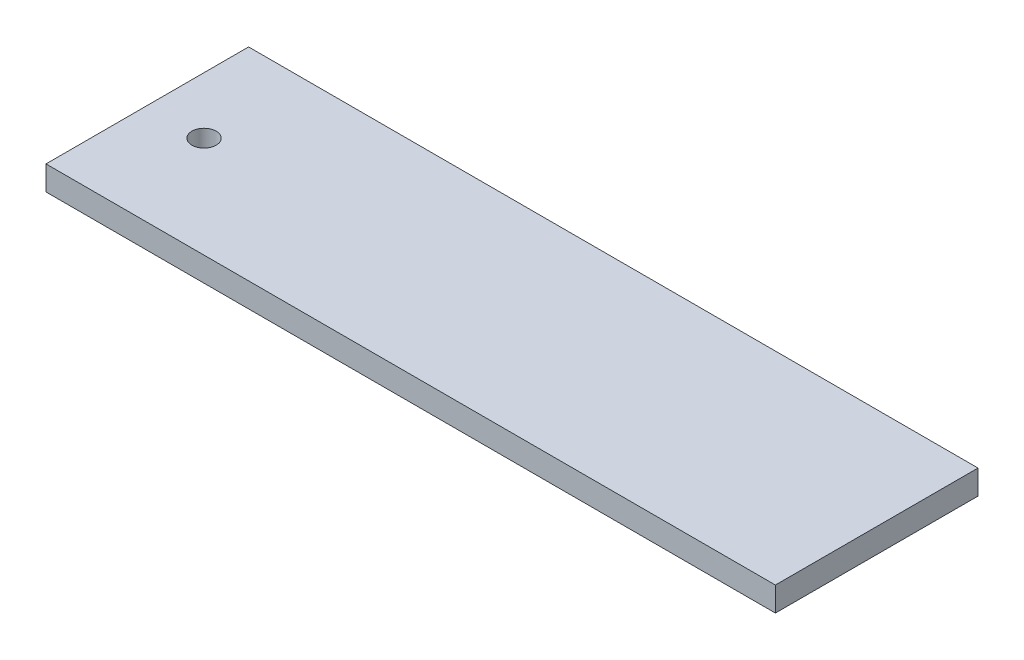
ISO-10303-21;
HEADER;
FILE_DESCRIPTION(('STEP AP214'),'2;1');
FILE_NAME('part.step','',(''),(''),'','','');
FILE_SCHEMA(('AUTOMOTIVE_DESIGN { 1 0 10303 214 1 1 1 1 }'));
ENDSEC;
DATA;
#1=APPLICATION_CONTEXT('core data for automotive mechanical design processes');
#2=APPLICATION_PROTOCOL_DEFINITION('international standard','automotive_design',2000,#1);
#3=PRODUCT_CONTEXT('',#1,'mechanical');
#4=PRODUCT('Part','Part','',(#3));
#5=PRODUCT_RELATED_PRODUCT_CATEGORY('part','',(#4));
#6=PRODUCT_DEFINITION_FORMATION('','',#4);
#7=PRODUCT_DEFINITION_CONTEXT('part definition',#1,'design');
#8=PRODUCT_DEFINITION('design','',#6,#7);
#9=PRODUCT_DEFINITION_SHAPE('','',#8);
#10=(LENGTH_UNIT() NAMED_UNIT(*) SI_UNIT(.MILLI.,.METRE.));
#11=(NAMED_UNIT(*) PLANE_ANGLE_UNIT() SI_UNIT($,.RADIAN.));
#12=(NAMED_UNIT(*) SI_UNIT($,.STERADIAN.) SOLID_ANGLE_UNIT());
#13=UNCERTAINTY_MEASURE_WITH_UNIT(LENGTH_MEASURE(1.E-05),#10,'distance_accuracy_value','');
#14=(GEOMETRIC_REPRESENTATION_CONTEXT(3) GLOBAL_UNCERTAINTY_ASSIGNED_CONTEXT((#13)) GLOBAL_UNIT_ASSIGNED_CONTEXT((#10,
#11,#12)) REPRESENTATION_CONTEXT('',''));
#15=CARTESIAN_POINT('',(0.,0.,0.));
#16=DIRECTION('',(0.,0.,1.));
#17=DIRECTION('',(1.,0.,0.));
#18=AXIS2_PLACEMENT_3D('',#15,#16,#17);
#19=CARTESIAN_POINT('',(45.,3.,-12.5));
#20=DIRECTION('',(-1.,0.,0.));
#21=DIRECTION('',(0.,0.,1.));
#22=AXIS2_PLACEMENT_3D('',#19,#20,#21);
#23=PLANE('',#22);
#24=DIRECTION('',(0.,0.,-1.));
#25=VECTOR('',#24,1.);
#26=CARTESIAN_POINT('',(45.,0.,-12.5));
#27=LINE('',#26,#25);
#28=CARTESIAN_POINT('',(45.,0.,12.5));
#29=VERTEX_POINT('',#28);
#30=CARTESIAN_POINT('',(45.,0.,-12.5));
#31=VERTEX_POINT('',#30);
#32=EDGE_CURVE('E98',#29,#31,#27,.T.);
#33=ORIENTED_EDGE('',*,*,#32,.T.);
#34=DIRECTION('',(0.,-1.,0.));
#35=VECTOR('',#34,1.);
#36=CARTESIAN_POINT('',(45.,3.,-12.5));
#37=LINE('',#36,#35);
#38=CARTESIAN_POINT('',(45.,3.,-12.5));
#39=VERTEX_POINT('',#38);
#40=EDGE_CURVE('E11',#39,#31,#37,.T.);
#41=ORIENTED_EDGE('',*,*,#40,.F.);
#42=DIRECTION('',(0.,0.,-1.));
#43=VECTOR('',#42,1.);
#44=CARTESIAN_POINT('',(45.,3.,-12.5));
#45=LINE('',#44,#43);
#46=CARTESIAN_POINT('',(45.,3.,12.5));
#47=VERTEX_POINT('',#46);
#48=EDGE_CURVE('E85',#47,#39,#45,.T.);
#49=ORIENTED_EDGE('',*,*,#48,.F.);
#50=DIRECTION('',(0.,-1.,0.));
#51=VECTOR('',#50,1.);
#52=CARTESIAN_POINT('',(45.,3.,12.5));
#53=LINE('',#52,#51);
#54=EDGE_CURVE('E94',#47,#29,#53,.T.);
#55=ORIENTED_EDGE('',*,*,#54,.T.);
#56=EDGE_LOOP('',(#33,#41,#49,#55));
#57=FACE_BOUND('',#56,.T.);
#58=ADVANCED_FACE('F33',(#57),#23,.F.);
#59=CARTESIAN_POINT('',(-45.,3.,-12.5));
#60=DIRECTION('',(0.,0.,1.));
#61=DIRECTION('',(1.,0.,0.));
#62=AXIS2_PLACEMENT_3D('',#59,#60,#61);
#63=PLANE('',#62);
#64=DIRECTION('',(-1.,0.,0.));
#65=VECTOR('',#64,1.);
#66=CARTESIAN_POINT('',(-45.,0.,-12.5));
#67=LINE('',#66,#65);
#68=CARTESIAN_POINT('',(-45.,0.,-12.5));
#69=VERTEX_POINT('',#68);
#70=EDGE_CURVE('E89',#31,#69,#67,.T.);
#71=ORIENTED_EDGE('',*,*,#70,.T.);
#72=DIRECTION('',(0.,-1.,0.));
#73=VECTOR('',#72,1.);
#74=CARTESIAN_POINT('',(-45.,3.,-12.5));
#75=LINE('',#74,#73);
#76=CARTESIAN_POINT('',(-45.,3.,-12.5));
#77=VERTEX_POINT('',#76);
#78=EDGE_CURVE('E42',#77,#69,#75,.T.);
#79=ORIENTED_EDGE('',*,*,#78,.F.);
#80=DIRECTION('',(-1.,0.,0.));
#81=VECTOR('',#80,1.);
#82=CARTESIAN_POINT('',(-45.,3.,-12.5));
#83=LINE('',#82,#81);
#84=EDGE_CURVE('E80',#39,#77,#83,.T.);
#85=ORIENTED_EDGE('',*,*,#84,.F.);
#86=ORIENTED_EDGE('',*,*,#40,.T.);
#87=EDGE_LOOP('',(#71,#79,#85,#86));
#88=FACE_BOUND('',#87,.T.);
#89=ADVANCED_FACE('F88',(#88),#63,.F.);
#90=CARTESIAN_POINT('',(-45.,3.,-12.5));
#91=DIRECTION('',(1.,0.,0.));
#92=DIRECTION('',(0.,0.,-1.));
#93=AXIS2_PLACEMENT_3D('',#90,#91,#92);
#94=PLANE('',#93);
#95=DIRECTION('',(0.,0.,1.));
#96=VECTOR('',#95,1.);
#97=CARTESIAN_POINT('',(-45.,0.,-12.5));
#98=LINE('',#97,#96);
#99=CARTESIAN_POINT('',(-45.,0.,12.5));
#100=VERTEX_POINT('',#99);
#101=EDGE_CURVE('E67',#69,#100,#98,.T.);
#102=ORIENTED_EDGE('',*,*,#101,.T.);
#103=DIRECTION('',(0.,-1.,0.));
#104=VECTOR('',#103,1.);
#105=CARTESIAN_POINT('',(-45.,3.,12.5));
#106=LINE('',#105,#104);
#107=CARTESIAN_POINT('',(-45.,3.,12.5));
#108=VERTEX_POINT('',#107);
#109=EDGE_CURVE('E90',#108,#100,#106,.T.);
#110=ORIENTED_EDGE('',*,*,#109,.F.);
#111=DIRECTION('',(0.,0.,1.));
#112=VECTOR('',#111,1.);
#113=CARTESIAN_POINT('',(-45.,3.,-12.5));
#114=LINE('',#113,#112);
#115=EDGE_CURVE('E83',#77,#108,#114,.T.);
#116=ORIENTED_EDGE('',*,*,#115,.F.);
#117=ORIENTED_EDGE('',*,*,#78,.T.);
#118=EDGE_LOOP('',(#102,#110,#116,#117));
#119=FACE_BOUND('',#118,.T.);
#120=ADVANCED_FACE('F92',(#119),#94,.F.);
#121=CARTESIAN_POINT('',(-45.,3.,12.5));
#122=DIRECTION('',(0.,0.,-1.));
#123=DIRECTION('',(-1.,0.,0.));
#124=AXIS2_PLACEMENT_3D('',#121,#122,#123);
#125=PLANE('',#124);
#126=DIRECTION('',(1.,0.,0.));
#127=VECTOR('',#126,1.);
#128=CARTESIAN_POINT('',(-45.,0.,12.5));
#129=LINE('',#128,#127);
#130=EDGE_CURVE('E73',#100,#29,#129,.T.);
#131=ORIENTED_EDGE('',*,*,#130,.T.);
#132=ORIENTED_EDGE('',*,*,#54,.F.);
#133=DIRECTION('',(1.,0.,0.));
#134=VECTOR('',#133,1.);
#135=CARTESIAN_POINT('',(-45.,3.,12.5));
#136=LINE('',#135,#134);
#137=EDGE_CURVE('E50',#108,#47,#136,.T.);
#138=ORIENTED_EDGE('',*,*,#137,.F.);
#139=ORIENTED_EDGE('',*,*,#109,.T.);
#140=EDGE_LOOP('',(#131,#132,#138,#139));
#141=FACE_BOUND('',#140,.T.);
#142=ADVANCED_FACE('F105',(#141),#125,.F.);
#143=CARTESIAN_POINT('',(0.,3.,0.));
#144=DIRECTION('',(0.,1.,0.));
#145=DIRECTION('',(0.,0.,1.));
#146=AXIS2_PLACEMENT_3D('',#143,#144,#145);
#147=PLANE('',#146);
#148=CARTESIAN_POINT('',(-38.,3.,0.));
#149=DIRECTION('',(0.,1.,0.));
#150=DIRECTION('',(0.,0.,1.));
#151=AXIS2_PLACEMENT_3D('',#148,#149,#150);
#152=CIRCLE('',#151,1.5);
#153=CARTESIAN_POINT('',(-38.,3.,1.5));
#154=VERTEX_POINT('',#153);
#155=EDGE_CURVE('E111',#154,#154,#152,.T.);
#156=ORIENTED_EDGE('',*,*,#155,.F.);
#157=EDGE_LOOP('',(#156));
#158=FACE_BOUND('',#157,.T.);
#159=ORIENTED_EDGE('',*,*,#48,.T.);
#160=ORIENTED_EDGE('',*,*,#84,.T.);
#161=ORIENTED_EDGE('',*,*,#115,.T.);
#162=ORIENTED_EDGE('',*,*,#137,.T.);
#163=EDGE_LOOP('',(#159,#160,#161,#162));
#164=FACE_BOUND('',#163,.T.);
#165=ADVANCED_FACE('F81',(#158,#164),#147,.T.);
#166=CARTESIAN_POINT('',(0.,0.,0.));
#167=DIRECTION('',(0.,1.,0.));
#168=DIRECTION('',(0.,0.,1.));
#169=AXIS2_PLACEMENT_3D('',#166,#167,#168);
#170=PLANE('',#169);
#171=CARTESIAN_POINT('',(-38.,0.,0.));
#172=DIRECTION('',(0.,1.,0.));
#173=DIRECTION('',(0.,0.,1.));
#174=AXIS2_PLACEMENT_3D('',#171,#172,#173);
#175=CIRCLE('',#174,1.5);
#176=CARTESIAN_POINT('',(-38.,0.,1.5));
#177=VERTEX_POINT('',#176);
#178=EDGE_CURVE('E36',#177,#177,#175,.T.);
#179=ORIENTED_EDGE('',*,*,#178,.T.);
#180=EDGE_LOOP('',(#179));
#181=FACE_BOUND('',#180,.T.);
#182=ORIENTED_EDGE('',*,*,#32,.F.);
#183=ORIENTED_EDGE('',*,*,#130,.F.);
#184=ORIENTED_EDGE('',*,*,#101,.F.);
#185=ORIENTED_EDGE('',*,*,#70,.F.);
#186=EDGE_LOOP('',(#182,#183,#184,#185));
#187=FACE_BOUND('',#186,.T.);
#188=ADVANCED_FACE('F108',(#181,#187),#170,.F.);
#189=CARTESIAN_POINT('',(-38.,-7.,0.));
#190=DIRECTION('',(0.,1.,0.));
#191=DIRECTION('',(0.,0.,1.));
#192=AXIS2_PLACEMENT_3D('',#189,#190,#191);
#193=CYLINDRICAL_SURFACE('',#192,1.5);
#194=ORIENTED_EDGE('',*,*,#155,.T.);
#195=EDGE_LOOP('',(#194));
#196=FACE_BOUND('',#195,.T.);
#197=ORIENTED_EDGE('',*,*,#178,.F.);
#198=EDGE_LOOP('',(#197));
#199=FACE_BOUND('',#198,.T.);
#200=ADVANCED_FACE('F119',(#196,#199),#193,.F.);
#201=CLOSED_SHELL('',(#58,#89,#120,#142,#165,#188,#200));
#202=MANIFOLD_SOLID_BREP('B2',#201);
#203=ADVANCED_BREP_SHAPE_REPRESENTATION('',(#18,#202),#14);
#204=SHAPE_DEFINITION_REPRESENTATION(#9,#203);
ENDSEC;
END-ISO-10303-21;
